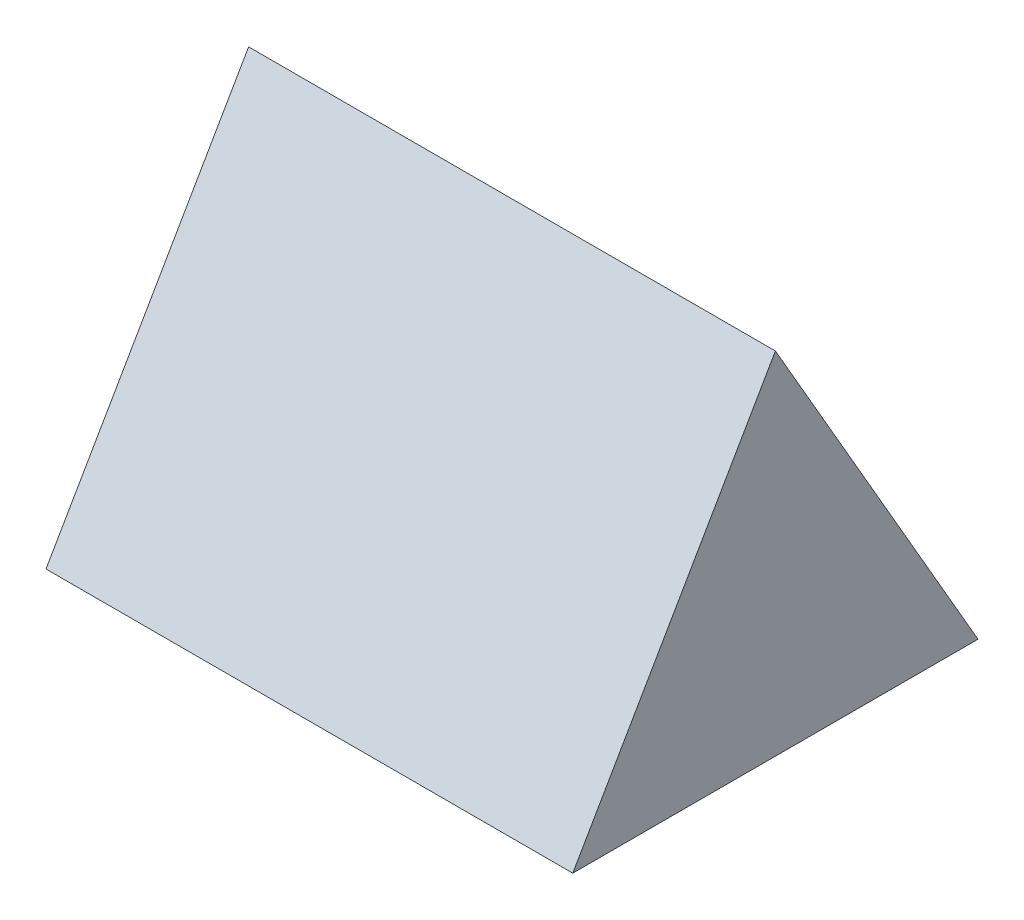
ISO-10303-21;
HEADER;
FILE_DESCRIPTION(('STEP AP214'),'2;1');
FILE_NAME('part.step','',(''),(''),'','','');
FILE_SCHEMA(('AUTOMOTIVE_DESIGN { 1 0 10303 214 1 1 1 1 }'));
ENDSEC;
DATA;
#1=APPLICATION_CONTEXT('core data for automotive mechanical design processes');
#2=APPLICATION_PROTOCOL_DEFINITION('international standard','automotive_design',2000,#1);
#3=PRODUCT_CONTEXT('',#1,'mechanical');
#4=PRODUCT('Part','Part','',(#3));
#5=PRODUCT_RELATED_PRODUCT_CATEGORY('part','',(#4));
#6=PRODUCT_DEFINITION_FORMATION('','',#4);
#7=PRODUCT_DEFINITION_CONTEXT('part definition',#1,'design');
#8=PRODUCT_DEFINITION('design','',#6,#7);
#9=PRODUCT_DEFINITION_SHAPE('','',#8);
#10=(LENGTH_UNIT() NAMED_UNIT(*) SI_UNIT(.MILLI.,.METRE.));
#11=(NAMED_UNIT(*) PLANE_ANGLE_UNIT() SI_UNIT($,.RADIAN.));
#12=(NAMED_UNIT(*) SI_UNIT($,.STERADIAN.) SOLID_ANGLE_UNIT());
#13=UNCERTAINTY_MEASURE_WITH_UNIT(LENGTH_MEASURE(1.E-05),#10,'distance_accuracy_value','');
#14=(GEOMETRIC_REPRESENTATION_CONTEXT(3) GLOBAL_UNCERTAINTY_ASSIGNED_CONTEXT((#13)) GLOBAL_UNIT_ASSIGNED_CONTEXT((#10,
#11,#12)) REPRESENTATION_CONTEXT('',''));
#15=CARTESIAN_POINT('',(0.,0.,0.));
#16=DIRECTION('',(0.,0.,1.));
#17=DIRECTION('',(1.,0.,0.));
#18=AXIS2_PLACEMENT_3D('',#15,#16,#17);
#19=CARTESIAN_POINT('',(65.,43.3012701892219,0.));
#20=DIRECTION('',(0.,-0.5,-0.866025403784439));
#21=DIRECTION('',(0.,0.866025403784439,-0.5));
#22=AXIS2_PLACEMENT_3D('',#19,#20,#21);
#23=PLANE('',#22);
#24=DIRECTION('',(0.,-0.866025403784439,0.5));
#25=VECTOR('',#24,1.);
#26=CARTESIAN_POINT('',(-65.,43.3012701892219,0.));
#27=LINE('',#26,#25);
#28=CARTESIAN_POINT('',(-65.,43.3012701892219,0.));
#29=VERTEX_POINT('',#28);
#30=CARTESIAN_POINT('',(-65.,-43.3012701892219,50.));
#31=VERTEX_POINT('',#30);
#32=EDGE_CURVE('E84',#29,#31,#27,.T.);
#33=ORIENTED_EDGE('',*,*,#32,.T.);
#34=DIRECTION('',(-1.,0.,0.));
#35=VECTOR('',#34,1.);
#36=CARTESIAN_POINT('',(65.,-43.3012701892219,50.));
#37=LINE('',#36,#35);
#38=CARTESIAN_POINT('',(65.,-43.3012701892219,50.));
#39=VERTEX_POINT('',#38);
#40=EDGE_CURVE('E11',#39,#31,#37,.T.);
#41=ORIENTED_EDGE('',*,*,#40,.F.);
#42=DIRECTION('',(0.,-0.866025403784439,0.5));
#43=VECTOR('',#42,1.);
#44=CARTESIAN_POINT('',(65.,43.3012701892219,0.));
#45=LINE('',#44,#43);
#46=CARTESIAN_POINT('',(65.,43.3012701892219,0.));
#47=VERTEX_POINT('',#46);
#48=EDGE_CURVE('E77',#47,#39,#45,.T.);
#49=ORIENTED_EDGE('',*,*,#48,.F.);
#50=DIRECTION('',(-1.,0.,0.));
#51=VECTOR('',#50,1.);
#52=CARTESIAN_POINT('',(65.,43.3012701892219,0.));
#53=LINE('',#52,#51);
#54=EDGE_CURVE('E85',#47,#29,#53,.T.);
#55=ORIENTED_EDGE('',*,*,#54,.T.);
#56=EDGE_LOOP('',(#33,#41,#49,#55));
#57=FACE_BOUND('',#56,.T.);
#58=ADVANCED_FACE('F37',(#57),#23,.F.);
#59=CARTESIAN_POINT('',(65.,-43.3012701892219,50.));
#60=DIRECTION('',(0.,1.,0.));
#61=DIRECTION('',(0.,0.,1.));
#62=AXIS2_PLACEMENT_3D('',#59,#60,#61);
#63=PLANE('',#62);
#64=DIRECTION('',(0.,0.,-1.));
#65=VECTOR('',#64,1.);
#66=CARTESIAN_POINT('',(-65.,-43.3012701892219,50.));
#67=LINE('',#66,#65);
#68=CARTESIAN_POINT('',(-65.,-43.3012701892219,-50.));
#69=VERTEX_POINT('',#68);
#70=EDGE_CURVE('E65',#31,#69,#67,.T.);
#71=ORIENTED_EDGE('',*,*,#70,.T.);
#72=DIRECTION('',(-1.,0.,0.));
#73=VECTOR('',#72,1.);
#74=CARTESIAN_POINT('',(65.,-43.3012701892219,-50.));
#75=LINE('',#74,#73);
#76=CARTESIAN_POINT('',(65.,-43.3012701892219,-50.));
#77=VERTEX_POINT('',#76);
#78=EDGE_CURVE('E45',#77,#69,#75,.T.);
#79=ORIENTED_EDGE('',*,*,#78,.F.);
#80=DIRECTION('',(0.,0.,-1.));
#81=VECTOR('',#80,1.);
#82=CARTESIAN_POINT('',(65.,-43.3012701892219,50.));
#83=LINE('',#82,#81);
#84=EDGE_CURVE('E73',#39,#77,#83,.T.);
#85=ORIENTED_EDGE('',*,*,#84,.F.);
#86=ORIENTED_EDGE('',*,*,#40,.T.);
#87=EDGE_LOOP('',(#71,#79,#85,#86));
#88=FACE_BOUND('',#87,.T.);
#89=ADVANCED_FACE('F74',(#88),#63,.F.);
#90=CARTESIAN_POINT('',(65.,-43.3012701892219,-50.));
#91=DIRECTION('',(0.,-0.5,0.866025403784439));
#92=DIRECTION('',(0.,-0.866025403784439,-0.5));
#93=AXIS2_PLACEMENT_3D('',#90,#91,#92);
#94=PLANE('',#93);
#95=DIRECTION('',(0.,0.866025403784439,0.5));
#96=VECTOR('',#95,1.);
#97=CARTESIAN_POINT('',(-65.,-43.3012701892219,-50.));
#98=LINE('',#97,#96);
#99=EDGE_CURVE('E70',#69,#29,#98,.T.);
#100=ORIENTED_EDGE('',*,*,#99,.T.);
#101=ORIENTED_EDGE('',*,*,#54,.F.);
#102=DIRECTION('',(0.,0.866025403784439,0.5));
#103=VECTOR('',#102,1.);
#104=CARTESIAN_POINT('',(65.,-43.3012701892219,-50.));
#105=LINE('',#104,#103);
#106=EDGE_CURVE('E53',#77,#47,#105,.T.);
#107=ORIENTED_EDGE('',*,*,#106,.F.);
#108=ORIENTED_EDGE('',*,*,#78,.T.);
#109=EDGE_LOOP('',(#100,#101,#107,#108));
#110=FACE_BOUND('',#109,.T.);
#111=ADVANCED_FACE('F92',(#110),#94,.F.);
#112=CARTESIAN_POINT('',(65.,0.,0.));
#113=DIRECTION('',(1.,0.,0.));
#114=DIRECTION('',(0.,0.,-1.));
#115=AXIS2_PLACEMENT_3D('',#112,#113,#114);
#116=PLANE('',#115);
#117=ORIENTED_EDGE('',*,*,#48,.T.);
#118=ORIENTED_EDGE('',*,*,#84,.T.);
#119=ORIENTED_EDGE('',*,*,#106,.T.);
#120=EDGE_LOOP('',(#117,#118,#119));
#121=FACE_BOUND('',#120,.T.);
#122=ADVANCED_FACE('F80',(#121),#116,.T.);
#123=CARTESIAN_POINT('',(-65.,0.,0.));
#124=DIRECTION('',(1.,0.,0.));
#125=DIRECTION('',(0.,0.,-1.));
#126=AXIS2_PLACEMENT_3D('',#123,#124,#125);
#127=PLANE('',#126);
#128=ORIENTED_EDGE('',*,*,#32,.F.);
#129=ORIENTED_EDGE('',*,*,#99,.F.);
#130=ORIENTED_EDGE('',*,*,#70,.F.);
#131=EDGE_LOOP('',(#128,#129,#130));
#132=FACE_BOUND('',#131,.T.);
#133=ADVANCED_FACE('F93',(#132),#127,.F.);
#134=CLOSED_SHELL('',(#58,#89,#111,#122,#133));
#135=MANIFOLD_SOLID_BREP('B2',#134);
#136=ADVANCED_BREP_SHAPE_REPRESENTATION('',(#18,#135),#14);
#137=SHAPE_DEFINITION_REPRESENTATION(#9,#136);
ENDSEC;
END-ISO-10303-21;
